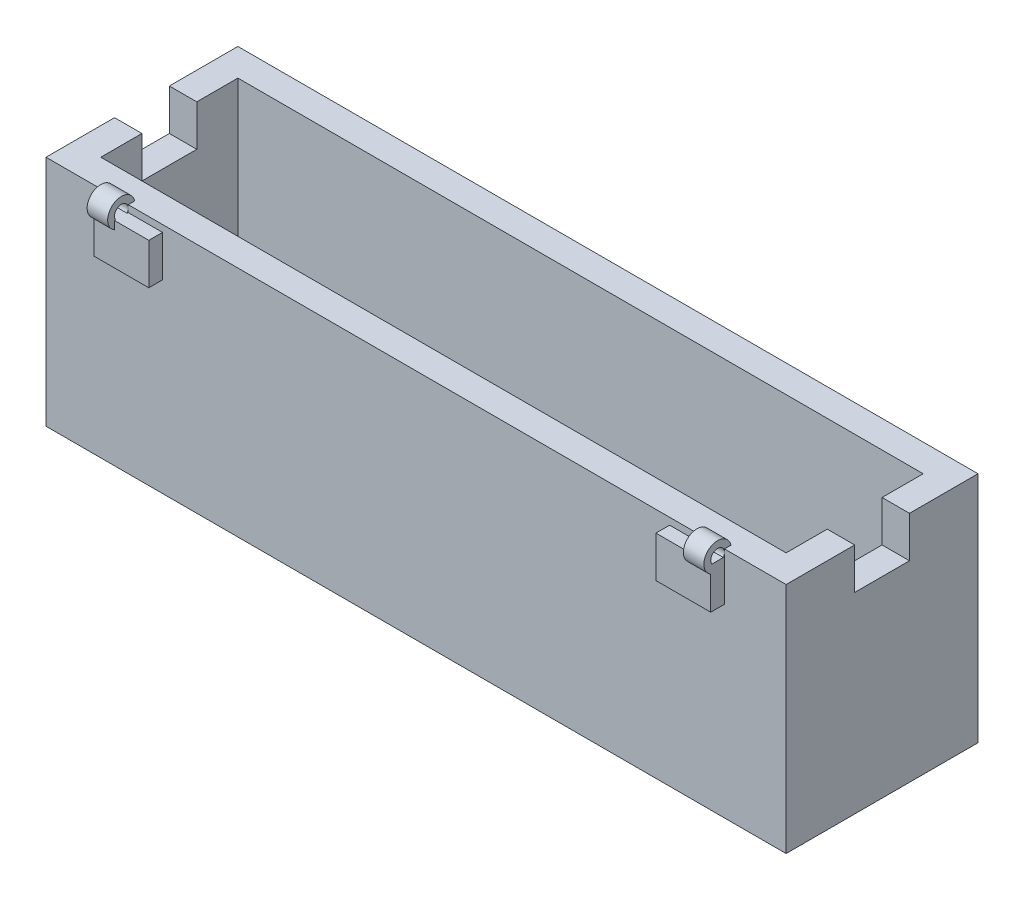
ISO-10303-21;
HEADER;
FILE_DESCRIPTION(('STEP AP214'),'2;1');
FILE_NAME('part.step','',(''),(''),'','','');
FILE_SCHEMA(('AUTOMOTIVE_DESIGN { 1 0 10303 214 1 1 1 1 }'));
ENDSEC;
DATA;
#1=APPLICATION_CONTEXT('core data for automotive mechanical design processes');
#2=APPLICATION_PROTOCOL_DEFINITION('international standard','automotive_design',2000,#1);
#3=PRODUCT_CONTEXT('',#1,'mechanical');
#4=PRODUCT('Part','Part','',(#3));
#5=PRODUCT_RELATED_PRODUCT_CATEGORY('part','',(#4));
#6=PRODUCT_DEFINITION_FORMATION('','',#4);
#7=PRODUCT_DEFINITION_CONTEXT('part definition',#1,'design');
#8=PRODUCT_DEFINITION('design','',#6,#7);
#9=PRODUCT_DEFINITION_SHAPE('','',#8);
#10=(LENGTH_UNIT() NAMED_UNIT(*) SI_UNIT(.MILLI.,.METRE.));
#11=(NAMED_UNIT(*) PLANE_ANGLE_UNIT() SI_UNIT($,.RADIAN.));
#12=(NAMED_UNIT(*) SI_UNIT($,.STERADIAN.) SOLID_ANGLE_UNIT());
#13=UNCERTAINTY_MEASURE_WITH_UNIT(LENGTH_MEASURE(1.E-05),#10,'distance_accuracy_value','');
#14=(GEOMETRIC_REPRESENTATION_CONTEXT(3) GLOBAL_UNCERTAINTY_ASSIGNED_CONTEXT((#13)) GLOBAL_UNIT_ASSIGNED_CONTEXT((#10,
#11,#12)) REPRESENTATION_CONTEXT('',''));
#15=CARTESIAN_POINT('',(0.,0.,0.));
#16=DIRECTION('',(0.,0.,1.));
#17=DIRECTION('',(1.,0.,0.));
#18=AXIS2_PLACEMENT_3D('',#15,#16,#17);
#19=CARTESIAN_POINT('',(0.,140.,0.));
#20=DIRECTION('',(0.,1.,0.));
#21=DIRECTION('',(0.,0.,1.));
#22=AXIS2_PLACEMENT_3D('',#19,#20,#21);
#23=PLANE('',#22);
#24=DIRECTION('',(-1.,0.,0.));
#25=VECTOR('',#24,1.);
#26=CARTESIAN_POINT('',(270.,140.,-20.0000000000002));
#27=LINE('',#26,#25);
#28=CARTESIAN_POINT('',(270.,140.,-20.0000000000002));
#29=VERTEX_POINT('',#28);
#30=CARTESIAN_POINT('',(250.,140.,-20.0000000000002));
#31=VERTEX_POINT('',#30);
#32=EDGE_CURVE('E328',#29,#31,#27,.T.);
#33=ORIENTED_EDGE('',*,*,#32,.F.);
#34=DIRECTION('',(0.,0.,-1.));
#35=VECTOR('',#34,1.);
#36=CARTESIAN_POINT('',(270.,140.,-70.));
#37=LINE('',#36,#35);
#38=CARTESIAN_POINT('',(270.,140.,-70.));
#39=VERTEX_POINT('',#38);
#40=EDGE_CURVE('E485',#29,#39,#37,.T.);
#41=ORIENTED_EDGE('',*,*,#40,.T.);
#42=DIRECTION('',(-1.,0.,0.));
#43=VECTOR('',#42,1.);
#44=CARTESIAN_POINT('',(-270.,140.,-70.));
#45=LINE('',#44,#43);
#46=CARTESIAN_POINT('',(-270.,140.,-70.));
#47=VERTEX_POINT('',#46);
#48=EDGE_CURVE('E496',#39,#47,#45,.T.);
#49=ORIENTED_EDGE('',*,*,#48,.T.);
#50=DIRECTION('',(0.,0.,1.));
#51=VECTOR('',#50,1.);
#52=CARTESIAN_POINT('',(-270.,140.,-70.));
#53=LINE('',#52,#51);
#54=CARTESIAN_POINT('',(-270.,140.,-20.));
#55=VERTEX_POINT('',#54);
#56=EDGE_CURVE('E288',#47,#55,#53,.T.);
#57=ORIENTED_EDGE('',*,*,#56,.T.);
#58=CARTESIAN_POINT('',(-250.,140.,-20.));
#59=VERTEX_POINT('',#58);
#60=EDGE_CURVE('E331',#59,#55,#27,.T.);
#61=ORIENTED_EDGE('',*,*,#60,.F.);
#62=DIRECTION('',(0.,0.,1.));
#63=VECTOR('',#62,1.);
#64=CARTESIAN_POINT('',(-250.,140.,-50.));
#65=LINE('',#64,#63);
#66=CARTESIAN_POINT('',(-250.,140.,-50.));
#67=VERTEX_POINT('',#66);
#68=EDGE_CURVE('E476',#67,#59,#65,.T.);
#69=ORIENTED_EDGE('',*,*,#68,.F.);
#70=DIRECTION('',(-1.,0.,0.));
#71=VECTOR('',#70,1.);
#72=CARTESIAN_POINT('',(-250.,140.,-50.));
#73=LINE('',#72,#71);
#74=CARTESIAN_POINT('',(250.,140.,-50.));
#75=VERTEX_POINT('',#74);
#76=EDGE_CURVE('E472',#75,#67,#73,.T.);
#77=ORIENTED_EDGE('',*,*,#76,.F.);
#78=DIRECTION('',(0.,0.,-1.));
#79=VECTOR('',#78,1.);
#80=CARTESIAN_POINT('',(250.,140.,-50.));
#81=LINE('',#80,#79);
#82=EDGE_CURVE('E468',#31,#75,#81,.T.);
#83=ORIENTED_EDGE('',*,*,#82,.F.);
#84=EDGE_LOOP('',(#33,#41,#49,#57,#61,#69,#77,#83));
#85=FACE_BOUND('',#84,.T.);
#86=ADVANCED_FACE('F45',(#85),#23,.T.);
#87=CARTESIAN_POINT('',(-270.,140.,70.));
#88=DIRECTION('',(0.,0.,-1.));
#89=DIRECTION('',(-1.,0.,0.));
#90=AXIS2_PLACEMENT_3D('',#87,#88,#89);
#91=PLANE('',#90);
#92=DIRECTION('',(0.,1.,0.));
#93=VECTOR('',#92,1.);
#94=CARTESIAN_POINT('',(-210.,140.,70.));
#95=LINE('',#94,#93);
#96=CARTESIAN_POINT('',(-210.,135.,70.));
#97=VERTEX_POINT('',#96);
#98=CARTESIAN_POINT('',(-210.,137.764599118728,69.9999999999953));
#99=VERTEX_POINT('',#98);
#100=EDGE_CURVE('E369',#97,#99,#95,.T.);
#101=ORIENTED_EDGE('',*,*,#100,.F.);
#102=DIRECTION('',(1.,0.,0.));
#103=VECTOR('',#102,1.);
#104=CARTESIAN_POINT('',(-270.,135.,70.));
#105=LINE('',#104,#103);
#106=CARTESIAN_POINT('',(-185.,135.,70.));
#107=VERTEX_POINT('',#106);
#108=EDGE_CURVE('E452',#97,#107,#105,.T.);
#109=ORIENTED_EDGE('',*,*,#108,.T.);
#110=DIRECTION('',(0.,-1.,0.));
#111=VECTOR('',#110,1.);
#112=CARTESIAN_POINT('',(-185.,140.,70.));
#113=LINE('',#112,#111);
#114=CARTESIAN_POINT('',(-185.,105.,70.));
#115=VERTEX_POINT('',#114);
#116=EDGE_CURVE('E465',#107,#115,#113,.T.);
#117=ORIENTED_EDGE('',*,*,#116,.T.);
#118=DIRECTION('',(-1.,0.,0.));
#119=VECTOR('',#118,1.);
#120=CARTESIAN_POINT('',(-270.,105.,70.));
#121=LINE('',#120,#119);
#122=CARTESIAN_POINT('',(-225.,105.,70.));
#123=VERTEX_POINT('',#122);
#124=EDGE_CURVE('E462',#115,#123,#121,.T.);
#125=ORIENTED_EDGE('',*,*,#124,.T.);
#126=DIRECTION('',(0.,1.,0.));
#127=VECTOR('',#126,1.);
#128=CARTESIAN_POINT('',(-225.,140.,70.));
#129=LINE('',#128,#127);
#130=CARTESIAN_POINT('',(-225.,137.764599118728,69.9999999999953));
#131=VERTEX_POINT('',#130);
#132=EDGE_CURVE('E460',#123,#131,#129,.T.);
#133=ORIENTED_EDGE('',*,*,#132,.T.);
#134=DIRECTION('',(0.,1.,0.));
#135=VECTOR('',#134,1.);
#136=CARTESIAN_POINT('',(-225.,140.,70.));
#137=LINE('',#136,#135);
#138=CARTESIAN_POINT('',(-225.,140.,70.));
#139=VERTEX_POINT('',#138);
#140=EDGE_CURVE('E359',#131,#139,#137,.T.);
#141=ORIENTED_EDGE('',*,*,#140,.T.);
#142=DIRECTION('',(1.,0.,0.));
#143=VECTOR('',#142,1.);
#144=CARTESIAN_POINT('',(-270.,140.,70.));
#145=LINE('',#144,#143);
#146=CARTESIAN_POINT('',(-270.,140.,70.));
#147=VERTEX_POINT('',#146);
#148=EDGE_CURVE('E501',#147,#139,#145,.T.);
#149=ORIENTED_EDGE('',*,*,#148,.F.);
#150=DIRECTION('',(0.,-1.,0.));
#151=VECTOR('',#150,1.);
#152=CARTESIAN_POINT('',(-270.,140.,70.));
#153=LINE('',#152,#151);
#154=CARTESIAN_POINT('',(-270.,-30.,70.));
#155=VERTEX_POINT('',#154);
#156=EDGE_CURVE('E292',#147,#155,#153,.T.);
#157=ORIENTED_EDGE('',*,*,#156,.T.);
#158=DIRECTION('',(-1.,0.,0.));
#159=VECTOR('',#158,1.);
#160=CARTESIAN_POINT('',(-270.,-30.,70.));
#161=LINE('',#160,#159);
#162=CARTESIAN_POINT('',(270.,-30.,70.));
#163=VERTEX_POINT('',#162);
#164=EDGE_CURVE('E306',#163,#155,#161,.T.);
#165=ORIENTED_EDGE('',*,*,#164,.F.);
#166=DIRECTION('',(0.,-1.,0.));
#167=VECTOR('',#166,1.);
#168=CARTESIAN_POINT('',(270.,140.,70.));
#169=LINE('',#168,#167);
#170=CARTESIAN_POINT('',(270.,140.,70.));
#171=VERTEX_POINT('',#170);
#172=EDGE_CURVE('E504',#171,#163,#169,.T.);
#173=ORIENTED_EDGE('',*,*,#172,.F.);
#174=CARTESIAN_POINT('',(225.,140.,70.));
#175=VERTEX_POINT('',#174);
#176=EDGE_CURVE('E500',#175,#171,#145,.T.);
#177=ORIENTED_EDGE('',*,*,#176,.F.);
#178=DIRECTION('',(0.,-1.,0.));
#179=VECTOR('',#178,1.);
#180=CARTESIAN_POINT('',(225.,140.,70.));
#181=LINE('',#180,#179);
#182=CARTESIAN_POINT('',(225.,137.76459911873,69.9999999999943));
#183=VERTEX_POINT('',#182);
#184=EDGE_CURVE('E392',#175,#183,#181,.T.);
#185=ORIENTED_EDGE('',*,*,#184,.T.);
#186=DIRECTION('',(0.,-1.,0.));
#187=VECTOR('',#186,1.);
#188=CARTESIAN_POINT('',(225.,140.,70.));
#189=LINE('',#188,#187);
#190=CARTESIAN_POINT('',(225.,105.,70.));
#191=VERTEX_POINT('',#190);
#192=EDGE_CURVE('E436',#183,#191,#189,.T.);
#193=ORIENTED_EDGE('',*,*,#192,.T.);
#194=DIRECTION('',(-1.,0.,0.));
#195=VECTOR('',#194,1.);
#196=CARTESIAN_POINT('',(-270.,105.,70.));
#197=LINE('',#196,#195);
#198=CARTESIAN_POINT('',(185.,105.,70.));
#199=VERTEX_POINT('',#198);
#200=EDGE_CURVE('E433',#191,#199,#197,.T.);
#201=ORIENTED_EDGE('',*,*,#200,.T.);
#202=DIRECTION('',(0.,1.,0.));
#203=VECTOR('',#202,1.);
#204=CARTESIAN_POINT('',(185.,140.,70.));
#205=LINE('',#204,#203);
#206=CARTESIAN_POINT('',(185.,135.,70.));
#207=VERTEX_POINT('',#206);
#208=EDGE_CURVE('E430',#199,#207,#205,.T.);
#209=ORIENTED_EDGE('',*,*,#208,.T.);
#210=DIRECTION('',(1.,0.,0.));
#211=VECTOR('',#210,1.);
#212=CARTESIAN_POINT('',(-270.,135.,70.));
#213=LINE('',#212,#211);
#214=CARTESIAN_POINT('',(210.,135.,70.));
#215=VERTEX_POINT('',#214);
#216=EDGE_CURVE('E420',#207,#215,#213,.T.);
#217=ORIENTED_EDGE('',*,*,#216,.T.);
#218=DIRECTION('',(0.,-1.,0.));
#219=VECTOR('',#218,1.);
#220=CARTESIAN_POINT('',(210.,140.,70.));
#221=LINE('',#220,#219);
#222=CARTESIAN_POINT('',(210.,137.76459911873,69.9999999999943));
#223=VERTEX_POINT('',#222);
#224=EDGE_CURVE('E399',#223,#215,#221,.T.);
#225=ORIENTED_EDGE('',*,*,#224,.F.);
#226=CARTESIAN_POINT('',(210.,140.,70.));
#227=VERTEX_POINT('',#226);
#228=EDGE_CURVE('E401',#227,#223,#221,.T.);
#229=ORIENTED_EDGE('',*,*,#228,.F.);
#230=CARTESIAN_POINT('',(-210.,140.,70.));
#231=VERTEX_POINT('',#230);
#232=EDGE_CURVE('E505',#231,#227,#145,.T.);
#233=ORIENTED_EDGE('',*,*,#232,.F.);
#234=EDGE_CURVE('E371',#99,#231,#95,.T.);
#235=ORIENTED_EDGE('',*,*,#234,.F.);
#236=EDGE_LOOP('',(#101,#109,#117,#125,#133,#141,#149,#157,#165,#173,#177,#185,#193,#201,#209,
#217,#225,#229,#233,#235));
#237=FACE_BOUND('',#236,.T.);
#238=ADVANCED_FACE('F595',(#237),#91,.F.);
#239=DIRECTION('',(-1.,0.,0.));
#240=VECTOR('',#239,1.);
#241=CARTESIAN_POINT('',(270.,140.,19.9999999999998));
#242=LINE('',#241,#240);
#243=CARTESIAN_POINT('',(-250.,140.,20.));
#244=VERTEX_POINT('',#243);
#245=CARTESIAN_POINT('',(-270.,140.,20.));
#246=VERTEX_POINT('',#245);
#247=EDGE_CURVE('E335',#244,#246,#242,.T.);
#248=ORIENTED_EDGE('',*,*,#247,.T.);
#249=EDGE_CURVE('E498',#246,#147,#53,.T.);
#250=ORIENTED_EDGE('',*,*,#249,.T.);
#251=ORIENTED_EDGE('',*,*,#148,.T.);
#252=DIRECTION('',(0.,0.,1.));
#253=VECTOR('',#252,1.);
#254=CARTESIAN_POINT('',(-225.,140.,0.));
#255=LINE('',#254,#253);
#256=CARTESIAN_POINT('',(-225.,140.,65.2530526368458));
#257=VERTEX_POINT('',#256);
#258=EDGE_CURVE('E364',#257,#139,#255,.T.);
#259=ORIENTED_EDGE('',*,*,#258,.F.);
#260=DIRECTION('',(-1.,0.,0.));
#261=VECTOR('',#260,1.);
#262=CARTESIAN_POINT('',(-210.,140.,65.2530526368458));
#263=LINE('',#262,#261);
#264=CARTESIAN_POINT('',(-210.,140.,65.2530526368458));
#265=VERTEX_POINT('',#264);
#266=EDGE_CURVE('E375',#265,#257,#263,.T.);
#267=ORIENTED_EDGE('',*,*,#266,.F.);
#268=DIRECTION('',(0.,0.,1.));
#269=VECTOR('',#268,1.);
#270=CARTESIAN_POINT('',(-210.,140.,0.));
#271=LINE('',#270,#269);
#272=EDGE_CURVE('E372',#265,#231,#271,.T.);
#273=ORIENTED_EDGE('',*,*,#272,.T.);
#274=ORIENTED_EDGE('',*,*,#232,.T.);
#275=DIRECTION('',(0.,0.,-1.));
#276=VECTOR('',#275,1.);
#277=CARTESIAN_POINT('',(210.,140.,0.));
#278=LINE('',#277,#276);
#279=CARTESIAN_POINT('',(210.,140.,65.2530526368443));
#280=VERTEX_POINT('',#279);
#281=EDGE_CURVE('E402',#227,#280,#278,.T.);
#282=ORIENTED_EDGE('',*,*,#281,.T.);
#283=DIRECTION('',(1.,0.,0.));
#284=VECTOR('',#283,1.);
#285=CARTESIAN_POINT('',(210.,140.,65.2530526368443));
#286=LINE('',#285,#284);
#287=CARTESIAN_POINT('',(225.,140.,65.2530526368443));
#288=VERTEX_POINT('',#287);
#289=EDGE_CURVE('E405',#288,#280,#286,.F.);
#290=ORIENTED_EDGE('',*,*,#289,.F.);
#291=DIRECTION('',(0.,0.,-1.));
#292=VECTOR('',#291,1.);
#293=CARTESIAN_POINT('',(225.,140.,0.));
#294=LINE('',#293,#292);
#295=EDGE_CURVE('E389',#175,#288,#294,.T.);
#296=ORIENTED_EDGE('',*,*,#295,.F.);
#297=ORIENTED_EDGE('',*,*,#176,.T.);
#298=CARTESIAN_POINT('',(270.,140.,19.9999999999998));
#299=VERTEX_POINT('',#298);
#300=EDGE_CURVE('E493',#171,#299,#37,.T.);
#301=ORIENTED_EDGE('',*,*,#300,.T.);
#302=CARTESIAN_POINT('',(250.,140.,19.9999999999998));
#303=VERTEX_POINT('',#302);
#304=EDGE_CURVE('E332',#299,#303,#242,.T.);
#305=ORIENTED_EDGE('',*,*,#304,.T.);
#306=CARTESIAN_POINT('',(250.,140.,50.));
#307=VERTEX_POINT('',#306);
#308=EDGE_CURVE('E469',#307,#303,#81,.T.);
#309=ORIENTED_EDGE('',*,*,#308,.F.);
#310=DIRECTION('',(1.,0.,0.));
#311=VECTOR('',#310,1.);
#312=CARTESIAN_POINT('',(-250.,140.,50.));
#313=LINE('',#312,#311);
#314=CARTESIAN_POINT('',(-250.,140.,50.));
#315=VERTEX_POINT('',#314);
#316=EDGE_CURVE('E479',#315,#307,#313,.T.);
#317=ORIENTED_EDGE('',*,*,#316,.F.);
#318=EDGE_CURVE('E475',#244,#315,#65,.T.);
#319=ORIENTED_EDGE('',*,*,#318,.F.);
#320=EDGE_LOOP('',(#248,#250,#251,#259,#267,#273,#274,#282,#290,#296,#297,#301,#305,#309,#317,#319));
#321=FACE_BOUND('',#320,.T.);
#322=ADVANCED_FACE('F552',(#321),#23,.T.);
#323=CARTESIAN_POINT('',(-225.,135.,50.));
#324=DIRECTION('',(0.,1.,0.));
#325=DIRECTION('',(0.,0.,1.));
#326=AXIS2_PLACEMENT_3D('',#323,#324,#325);
#327=PLANE('',#326);
#328=ORIENTED_EDGE('',*,*,#108,.F.);
#329=DIRECTION('',(0.,0.,1.));
#330=VECTOR('',#329,1.);
#331=CARTESIAN_POINT('',(-210.,135.,50.));
#332=LINE('',#331,#330);
#333=CARTESIAN_POINT('',(-210.,135.,70.8338276904611));
#334=VERTEX_POINT('',#333);
#335=EDGE_CURVE('E368',#97,#334,#332,.T.);
#336=ORIENTED_EDGE('',*,*,#335,.T.);
#337=DIRECTION('',(-1.,0.,0.));
#338=VECTOR('',#337,1.);
#339=CARTESIAN_POINT('',(-210.,135.,70.8338276904611));
#340=LINE('',#339,#338);
#341=CARTESIAN_POINT('',(-225.,135.,70.8338276904611));
#342=VERTEX_POINT('',#341);
#343=EDGE_CURVE('E538',#334,#342,#340,.T.);
#344=ORIENTED_EDGE('',*,*,#343,.T.);
#345=DIRECTION('',(0.,0.,1.));
#346=VECTOR('',#345,1.);
#347=CARTESIAN_POINT('',(-225.,135.,50.));
#348=LINE('',#347,#346);
#349=CARTESIAN_POINT('',(-225.,135.,79.1661723095276));
#350=VERTEX_POINT('',#349);
#351=EDGE_CURVE('E456',#342,#350,#348,.T.);
#352=ORIENTED_EDGE('',*,*,#351,.T.);
#353=DIRECTION('',(-1.,0.,0.));
#354=VECTOR('',#353,1.);
#355=CARTESIAN_POINT('',(-210.,135.,79.1661723095276));
#356=LINE('',#355,#354);
#357=CARTESIAN_POINT('',(-210.,135.,79.1661723095276));
#358=VERTEX_POINT('',#357);
#359=EDGE_CURVE('E536',#350,#358,#356,.F.);
#360=ORIENTED_EDGE('',*,*,#359,.T.);
#361=CARTESIAN_POINT('',(-210.,135.,80.));
#362=VERTEX_POINT('',#361);
#363=EDGE_CURVE('E366',#358,#362,#332,.T.);
#364=ORIENTED_EDGE('',*,*,#363,.T.);
#365=DIRECTION('',(-1.,0.,0.));
#366=VECTOR('',#365,1.);
#367=CARTESIAN_POINT('',(-225.,135.,80.));
#368=LINE('',#367,#366);
#369=CARTESIAN_POINT('',(-185.,135.,80.));
#370=VERTEX_POINT('',#369);
#371=EDGE_CURVE('E441',#370,#362,#368,.T.);
#372=ORIENTED_EDGE('',*,*,#371,.F.);
#373=DIRECTION('',(0.,0.,1.));
#374=VECTOR('',#373,1.);
#375=CARTESIAN_POINT('',(-185.,135.,50.));
#376=LINE('',#375,#374);
#377=EDGE_CURVE('E449',#107,#370,#376,.T.);
#378=ORIENTED_EDGE('',*,*,#377,.F.);
#379=EDGE_LOOP('',(#328,#336,#344,#352,#360,#364,#372,#378));
#380=FACE_BOUND('',#379,.T.);
#381=ADVANCED_FACE('F604',(#380),#327,.T.);
#382=CARTESIAN_POINT('',(185.,135.,50.));
#383=DIRECTION('',(0.,1.,0.));
#384=DIRECTION('',(0.,0.,1.));
#385=AXIS2_PLACEMENT_3D('',#382,#383,#384);
#386=PLANE('',#385);
#387=DIRECTION('',(-1.,0.,0.));
#388=VECTOR('',#387,1.);
#389=CARTESIAN_POINT('',(185.,135.,80.));
#390=LINE('',#389,#388);
#391=CARTESIAN_POINT('',(210.,135.,80.));
#392=VERTEX_POINT('',#391);
#393=CARTESIAN_POINT('',(185.,135.,80.));
#394=VERTEX_POINT('',#393);
#395=EDGE_CURVE('E409',#392,#394,#390,.T.);
#396=ORIENTED_EDGE('',*,*,#395,.F.);
#397=DIRECTION('',(0.,0.,-1.));
#398=VECTOR('',#397,1.);
#399=CARTESIAN_POINT('',(210.,135.,50.));
#400=LINE('',#399,#398);
#401=CARTESIAN_POINT('',(210.,135.,79.166172309527));
#402=VERTEX_POINT('',#401);
#403=EDGE_CURVE('E395',#392,#402,#400,.T.);
#404=ORIENTED_EDGE('',*,*,#403,.T.);
#405=DIRECTION('',(1.,0.,0.));
#406=VECTOR('',#405,1.);
#407=CARTESIAN_POINT('',(210.,135.,79.166172309527));
#408=LINE('',#407,#406);
#409=CARTESIAN_POINT('',(225.,135.,79.166172309527));
#410=VERTEX_POINT('',#409);
#411=EDGE_CURVE('E529',#402,#410,#408,.T.);
#412=ORIENTED_EDGE('',*,*,#411,.T.);
#413=DIRECTION('',(0.,0.,1.));
#414=VECTOR('',#413,1.);
#415=CARTESIAN_POINT('',(225.,135.,50.));
#416=LINE('',#415,#414);
#417=CARTESIAN_POINT('',(225.,135.,70.8338276904617));
#418=VERTEX_POINT('',#417);
#419=EDGE_CURVE('E417',#418,#410,#416,.T.);
#420=ORIENTED_EDGE('',*,*,#419,.F.);
#421=DIRECTION('',(1.,0.,0.));
#422=VECTOR('',#421,1.);
#423=CARTESIAN_POINT('',(210.,135.,70.8338276904617));
#424=LINE('',#423,#422);
#425=CARTESIAN_POINT('',(210.,135.,70.8338276904617));
#426=VERTEX_POINT('',#425);
#427=EDGE_CURVE('E526',#418,#426,#424,.F.);
#428=ORIENTED_EDGE('',*,*,#427,.T.);
#429=EDGE_CURVE('E398',#426,#215,#400,.T.);
#430=ORIENTED_EDGE('',*,*,#429,.T.);
#431=ORIENTED_EDGE('',*,*,#216,.F.);
#432=DIRECTION('',(0.,0.,1.));
#433=VECTOR('',#432,1.);
#434=CARTESIAN_POINT('',(185.,135.,50.));
#435=LINE('',#434,#433);
#436=EDGE_CURVE('E423',#207,#394,#435,.T.);
#437=ORIENTED_EDGE('',*,*,#436,.T.);
#438=EDGE_LOOP('',(#396,#404,#412,#420,#428,#430,#431,#437));
#439=FACE_BOUND('',#438,.T.);
#440=ADVANCED_FACE('F608',(#439),#386,.T.);
#441=CARTESIAN_POINT('',(270.,140.,-70.));
#442=DIRECTION('',(-1.,0.,0.));
#443=DIRECTION('',(0.,0.,1.));
#444=AXIS2_PLACEMENT_3D('',#441,#442,#443);
#445=PLANE('',#444);
#446=ORIENTED_EDGE('',*,*,#40,.F.);
#447=DIRECTION('',(0.,-1.,0.));
#448=VECTOR('',#447,1.);
#449=CARTESIAN_POINT('',(270.,140.,-20.0000000000002));
#450=LINE('',#449,#448);
#451=CARTESIAN_POINT('',(270.,110.,-20.0000000000002));
#452=VERTEX_POINT('',#451);
#453=EDGE_CURVE('E312',#29,#452,#450,.T.);
#454=ORIENTED_EDGE('',*,*,#453,.T.);
#455=DIRECTION('',(0.,0.,1.));
#456=VECTOR('',#455,1.);
#457=CARTESIAN_POINT('',(270.,110.,-20.0000000000002));
#458=LINE('',#457,#456);
#459=CARTESIAN_POINT('',(270.,110.,19.9999999999998));
#460=VERTEX_POINT('',#459);
#461=EDGE_CURVE('E315',#452,#460,#458,.T.);
#462=ORIENTED_EDGE('',*,*,#461,.T.);
#463=DIRECTION('',(0.,1.,0.));
#464=VECTOR('',#463,1.);
#465=CARTESIAN_POINT('',(270.,140.,19.9999999999998));
#466=LINE('',#465,#464);
#467=EDGE_CURVE('E319',#460,#299,#466,.T.);
#468=ORIENTED_EDGE('',*,*,#467,.T.);
#469=ORIENTED_EDGE('',*,*,#300,.F.);
#470=ORIENTED_EDGE('',*,*,#172,.T.);
#471=DIRECTION('',(0.,0.,1.));
#472=VECTOR('',#471,1.);
#473=CARTESIAN_POINT('',(270.,-30.,-70.));
#474=LINE('',#473,#472);
#475=CARTESIAN_POINT('',(270.,-30.,-70.));
#476=VERTEX_POINT('',#475);
#477=EDGE_CURVE('E301',#476,#163,#474,.T.);
#478=ORIENTED_EDGE('',*,*,#477,.F.);
#479=DIRECTION('',(0.,-1.,0.));
#480=VECTOR('',#479,1.);
#481=CARTESIAN_POINT('',(270.,140.,-70.));
#482=LINE('',#481,#480);
#483=EDGE_CURVE('E291',#39,#476,#482,.T.);
#484=ORIENTED_EDGE('',*,*,#483,.F.);
#485=EDGE_LOOP('',(#446,#454,#462,#468,#469,#470,#478,#484));
#486=FACE_BOUND('',#485,.T.);
#487=ADVANCED_FACE('F47',(#486),#445,.F.);
#488=CARTESIAN_POINT('',(-270.,140.,-70.));
#489=DIRECTION('',(0.,0.,1.));
#490=DIRECTION('',(1.,0.,0.));
#491=AXIS2_PLACEMENT_3D('',#488,#489,#490);
#492=PLANE('',#491);
#493=ORIENTED_EDGE('',*,*,#483,.T.);
#494=DIRECTION('',(1.,0.,0.));
#495=VECTOR('',#494,1.);
#496=CARTESIAN_POINT('',(-270.,-30.,-70.));
#497=LINE('',#496,#495);
#498=CARTESIAN_POINT('',(-270.,-30.,-70.));
#499=VERTEX_POINT('',#498);
#500=EDGE_CURVE('E295',#499,#476,#497,.T.);
#501=ORIENTED_EDGE('',*,*,#500,.F.);
#502=DIRECTION('',(0.,-1.,0.));
#503=VECTOR('',#502,1.);
#504=CARTESIAN_POINT('',(-270.,140.,-70.));
#505=LINE('',#504,#503);
#506=EDGE_CURVE('E279',#47,#499,#505,.T.);
#507=ORIENTED_EDGE('',*,*,#506,.F.);
#508=ORIENTED_EDGE('',*,*,#48,.F.);
#509=EDGE_LOOP('',(#493,#501,#507,#508));
#510=FACE_BOUND('',#509,.T.);
#511=ADVANCED_FACE('F296',(#510),#492,.F.);
#512=CARTESIAN_POINT('',(-270.,140.,-70.));
#513=DIRECTION('',(1.,0.,0.));
#514=DIRECTION('',(0.,0.,-1.));
#515=AXIS2_PLACEMENT_3D('',#512,#513,#514);
#516=PLANE('',#515);
#517=DIRECTION('',(0.,0.,1.));
#518=VECTOR('',#517,1.);
#519=CARTESIAN_POINT('',(-270.,110.,-20.));
#520=LINE('',#519,#518);
#521=CARTESIAN_POINT('',(-270.,110.,-20.));
#522=VERTEX_POINT('',#521);
#523=CARTESIAN_POINT('',(-270.,110.,20.));
#524=VERTEX_POINT('',#523);
#525=EDGE_CURVE('E325',#522,#524,#520,.T.);
#526=ORIENTED_EDGE('',*,*,#525,.F.);
#527=DIRECTION('',(0.,-1.,0.));
#528=VECTOR('',#527,1.);
#529=CARTESIAN_POINT('',(-270.,140.,-20.));
#530=LINE('',#529,#528);
#531=EDGE_CURVE('E311',#55,#522,#530,.T.);
#532=ORIENTED_EDGE('',*,*,#531,.F.);
#533=ORIENTED_EDGE('',*,*,#56,.F.);
#534=ORIENTED_EDGE('',*,*,#506,.T.);
#535=DIRECTION('',(0.,0.,-1.));
#536=VECTOR('',#535,1.);
#537=CARTESIAN_POINT('',(-270.,-30.,-70.));
#538=LINE('',#537,#536);
#539=EDGE_CURVE('E285',#155,#499,#538,.T.);
#540=ORIENTED_EDGE('',*,*,#539,.F.);
#541=ORIENTED_EDGE('',*,*,#156,.F.);
#542=ORIENTED_EDGE('',*,*,#249,.F.);
#543=DIRECTION('',(0.,1.,0.));
#544=VECTOR('',#543,1.);
#545=CARTESIAN_POINT('',(-270.,140.,20.));
#546=LINE('',#545,#544);
#547=EDGE_CURVE('E316',#524,#246,#546,.T.);
#548=ORIENTED_EDGE('',*,*,#547,.F.);
#549=EDGE_LOOP('',(#526,#532,#533,#534,#540,#541,#542,#548));
#550=FACE_BOUND('',#549,.T.);
#551=ADVANCED_FACE('F282',(#550),#516,.F.);
#552=CARTESIAN_POINT('',(250.,-9.99999999999998,-50.));
#553=DIRECTION('',(1.,0.,0.));
#554=DIRECTION('',(0.,0.,-1.));
#555=AXIS2_PLACEMENT_3D('',#552,#553,#554);
#556=PLANE('',#555);
#557=DIRECTION('',(0.,0.,-1.));
#558=VECTOR('',#557,1.);
#559=CARTESIAN_POINT('',(250.,110.,-50.));
#560=LINE('',#559,#558);
#561=CARTESIAN_POINT('',(250.,110.,19.9999999999998));
#562=VERTEX_POINT('',#561);
#563=CARTESIAN_POINT('',(250.,110.,-20.0000000000002));
#564=VERTEX_POINT('',#563);
#565=EDGE_CURVE('E330',#562,#564,#560,.T.);
#566=ORIENTED_EDGE('',*,*,#565,.T.);
#567=DIRECTION('',(0.,1.,0.));
#568=VECTOR('',#567,1.);
#569=CARTESIAN_POINT('',(250.,-9.99999999999998,-20.0000000000002));
#570=LINE('',#569,#568);
#571=EDGE_CURVE('E345',#564,#31,#570,.T.);
#572=ORIENTED_EDGE('',*,*,#571,.T.);
#573=ORIENTED_EDGE('',*,*,#82,.T.);
#574=DIRECTION('',(0.,1.,0.));
#575=VECTOR('',#574,1.);
#576=CARTESIAN_POINT('',(250.,-9.99999999999998,-50.));
#577=LINE('',#576,#575);
#578=CARTESIAN_POINT('',(250.,0.,-50.));
#579=VERTEX_POINT('',#578);
#580=EDGE_CURVE('E482',#579,#75,#577,.T.);
#581=ORIENTED_EDGE('',*,*,#580,.F.);
#582=DIRECTION('',(0.,0.,-1.));
#583=VECTOR('',#582,1.);
#584=CARTESIAN_POINT('',(250.,0.,0.));
#585=LINE('',#584,#583);
#586=CARTESIAN_POINT('',(250.,0.,50.));
#587=VERTEX_POINT('',#586);
#588=EDGE_CURVE('E518',#587,#579,#585,.T.);
#589=ORIENTED_EDGE('',*,*,#588,.F.);
#590=DIRECTION('',(0.,1.,0.));
#591=VECTOR('',#590,1.);
#592=CARTESIAN_POINT('',(250.,-9.99999999999998,50.));
#593=LINE('',#592,#591);
#594=EDGE_CURVE('E483',#587,#307,#593,.T.);
#595=ORIENTED_EDGE('',*,*,#594,.T.);
#596=ORIENTED_EDGE('',*,*,#308,.T.);
#597=DIRECTION('',(0.,-1.,0.));
#598=VECTOR('',#597,1.);
#599=CARTESIAN_POINT('',(250.,-9.99999999999998,19.9999999999998));
#600=LINE('',#599,#598);
#601=EDGE_CURVE('E342',#303,#562,#600,.T.);
#602=ORIENTED_EDGE('',*,*,#601,.T.);
#603=EDGE_LOOP('',(#566,#572,#573,#581,#589,#595,#596,#602));
#604=FACE_BOUND('',#603,.T.);
#605=ADVANCED_FACE('F566',(#604),#556,.F.);
#606=CARTESIAN_POINT('',(-250.,-9.99999999999998,50.));
#607=DIRECTION('',(0.,0.,1.));
#608=DIRECTION('',(1.,0.,0.));
#609=AXIS2_PLACEMENT_3D('',#606,#607,#608);
#610=PLANE('',#609);
#611=DIRECTION('',(0.,1.,0.));
#612=VECTOR('',#611,1.);
#613=CARTESIAN_POINT('',(-250.,-9.99999999999998,50.));
#614=LINE('',#613,#612);
#615=CARTESIAN_POINT('',(-250.,0.,50.));
#616=VERTEX_POINT('',#615);
#617=EDGE_CURVE('E486',#616,#315,#614,.T.);
#618=ORIENTED_EDGE('',*,*,#617,.T.);
#619=ORIENTED_EDGE('',*,*,#316,.T.);
#620=ORIENTED_EDGE('',*,*,#594,.F.);
#621=DIRECTION('',(1.,0.,0.));
#622=VECTOR('',#621,1.);
#623=CARTESIAN_POINT('',(0.,0.,50.));
#624=LINE('',#623,#622);
#625=EDGE_CURVE('E515',#616,#587,#624,.T.);
#626=ORIENTED_EDGE('',*,*,#625,.F.);
#627=EDGE_LOOP('',(#618,#619,#620,#626));
#628=FACE_BOUND('',#627,.T.);
#629=ADVANCED_FACE('F557',(#628),#610,.F.);
#630=CARTESIAN_POINT('',(-250.,-9.99999999999998,-50.));
#631=DIRECTION('',(-1.,0.,0.));
#632=DIRECTION('',(0.,0.,1.));
#633=AXIS2_PLACEMENT_3D('',#630,#631,#632);
#634=PLANE('',#633);
#635=ORIENTED_EDGE('',*,*,#68,.T.);
#636=DIRECTION('',(0.,-1.,0.));
#637=VECTOR('',#636,1.);
#638=CARTESIAN_POINT('',(-250.,-9.99999999999998,-20.));
#639=LINE('',#638,#637);
#640=CARTESIAN_POINT('',(-250.,110.,-20.));
#641=VERTEX_POINT('',#640);
#642=EDGE_CURVE('E12',#59,#641,#639,.T.);
#643=ORIENTED_EDGE('',*,*,#642,.T.);
#644=DIRECTION('',(0.,0.,1.));
#645=VECTOR('',#644,1.);
#646=CARTESIAN_POINT('',(-250.,110.,-50.));
#647=LINE('',#646,#645);
#648=CARTESIAN_POINT('',(-250.,110.,20.));
#649=VERTEX_POINT('',#648);
#650=EDGE_CURVE('E541',#641,#649,#647,.T.);
#651=ORIENTED_EDGE('',*,*,#650,.T.);
#652=DIRECTION('',(0.,1.,0.));
#653=VECTOR('',#652,1.);
#654=CARTESIAN_POINT('',(-250.,-9.99999999999998,20.));
#655=LINE('',#654,#653);
#656=EDGE_CURVE('E53',#649,#244,#655,.T.);
#657=ORIENTED_EDGE('',*,*,#656,.T.);
#658=ORIENTED_EDGE('',*,*,#318,.T.);
#659=ORIENTED_EDGE('',*,*,#617,.F.);
#660=DIRECTION('',(0.,0.,1.));
#661=VECTOR('',#660,1.);
#662=CARTESIAN_POINT('',(-250.,0.,0.));
#663=LINE('',#662,#661);
#664=CARTESIAN_POINT('',(-250.,0.,-50.));
#665=VERTEX_POINT('',#664);
#666=EDGE_CURVE('E512',#665,#616,#663,.T.);
#667=ORIENTED_EDGE('',*,*,#666,.F.);
#668=DIRECTION('',(0.,1.,0.));
#669=VECTOR('',#668,1.);
#670=CARTESIAN_POINT('',(-250.,-9.99999999999998,-50.));
#671=LINE('',#670,#669);
#672=EDGE_CURVE('E489',#665,#67,#671,.T.);
#673=ORIENTED_EDGE('',*,*,#672,.T.);
#674=EDGE_LOOP('',(#635,#643,#651,#657,#658,#659,#667,#673));
#675=FACE_BOUND('',#674,.T.);
#676=ADVANCED_FACE('F546',(#675),#634,.F.);
#677=CARTESIAN_POINT('',(-250.,-9.99999999999998,-50.));
#678=DIRECTION('',(0.,0.,-1.));
#679=DIRECTION('',(-1.,0.,0.));
#680=AXIS2_PLACEMENT_3D('',#677,#678,#679);
#681=PLANE('',#680);
#682=ORIENTED_EDGE('',*,*,#580,.T.);
#683=ORIENTED_EDGE('',*,*,#76,.T.);
#684=ORIENTED_EDGE('',*,*,#672,.F.);
#685=DIRECTION('',(-1.,0.,0.));
#686=VECTOR('',#685,1.);
#687=CARTESIAN_POINT('',(0.,0.,-50.));
#688=LINE('',#687,#686);
#689=EDGE_CURVE('E509',#579,#665,#688,.T.);
#690=ORIENTED_EDGE('',*,*,#689,.F.);
#691=EDGE_LOOP('',(#682,#683,#684,#690));
#692=FACE_BOUND('',#691,.T.);
#693=ADVANCED_FACE('F563',(#692),#681,.F.);
#694=CARTESIAN_POINT('',(-185.,135.,50.));
#695=DIRECTION('',(1.,0.,0.));
#696=DIRECTION('',(0.,1.,0.));
#697=AXIS2_PLACEMENT_3D('',#694,#695,#696);
#698=PLANE('',#697);
#699=ORIENTED_EDGE('',*,*,#116,.F.);
#700=ORIENTED_EDGE('',*,*,#377,.T.);
#701=DIRECTION('',(0.,1.,0.));
#702=VECTOR('',#701,1.);
#703=CARTESIAN_POINT('',(-185.,135.,80.));
#704=LINE('',#703,#702);
#705=CARTESIAN_POINT('',(-185.,105.,80.));
#706=VERTEX_POINT('',#705);
#707=EDGE_CURVE('E438',#706,#370,#704,.T.);
#708=ORIENTED_EDGE('',*,*,#707,.F.);
#709=DIRECTION('',(0.,0.,1.));
#710=VECTOR('',#709,1.);
#711=CARTESIAN_POINT('',(-185.,105.,50.));
#712=LINE('',#711,#710);
#713=EDGE_CURVE('E450',#115,#706,#712,.T.);
#714=ORIENTED_EDGE('',*,*,#713,.F.);
#715=EDGE_LOOP('',(#699,#700,#708,#714));
#716=FACE_BOUND('',#715,.T.);
#717=ADVANCED_FACE('F621',(#716),#698,.T.);
#718=CARTESIAN_POINT('',(-225.,105.,50.));
#719=DIRECTION('',(0.,-1.,0.));
#720=DIRECTION('',(1.,0.,0.));
#721=AXIS2_PLACEMENT_3D('',#718,#719,#720);
#722=PLANE('',#721);
#723=ORIENTED_EDGE('',*,*,#124,.F.);
#724=ORIENTED_EDGE('',*,*,#713,.T.);
#725=DIRECTION('',(1.,0.,0.));
#726=VECTOR('',#725,1.);
#727=CARTESIAN_POINT('',(-225.,105.,80.));
#728=LINE('',#727,#726);
#729=CARTESIAN_POINT('',(-225.,105.,80.));
#730=VERTEX_POINT('',#729);
#731=EDGE_CURVE('E446',#730,#706,#728,.T.);
#732=ORIENTED_EDGE('',*,*,#731,.F.);
#733=DIRECTION('',(0.,0.,1.));
#734=VECTOR('',#733,1.);
#735=CARTESIAN_POINT('',(-225.,105.,50.));
#736=LINE('',#735,#734);
#737=EDGE_CURVE('E453',#123,#730,#736,.T.);
#738=ORIENTED_EDGE('',*,*,#737,.F.);
#739=EDGE_LOOP('',(#723,#724,#732,#738));
#740=FACE_BOUND('',#739,.T.);
#741=ADVANCED_FACE('F624',(#740),#722,.T.);
#742=CARTESIAN_POINT('',(-225.,135.,50.));
#743=DIRECTION('',(-1.,0.,0.));
#744=DIRECTION('',(0.,0.,1.));
#745=AXIS2_PLACEMENT_3D('',#742,#743,#744);
#746=PLANE('',#745);
#747=DIRECTION('',(0.,-1.,0.));
#748=VECTOR('',#747,1.);
#749=CARTESIAN_POINT('',(-225.,135.,80.));
#750=LINE('',#749,#748);
#751=CARTESIAN_POINT('',(-225.,129.104345080888,80.));
#752=VERTEX_POINT('',#751);
#753=EDGE_CURVE('E444',#752,#730,#750,.T.);
#754=ORIENTED_EDGE('',*,*,#753,.F.);
#755=CARTESIAN_POINT('',(-225.,137.764599118728,74.9999999999943));
#756=DIRECTION('',(-1.,0.,0.));
#757=DIRECTION('',(0.,0.,1.));
#758=AXIS2_PLACEMENT_3D('',#755,#756,#757);
#759=CIRCLE('',#758,9.99999999999908);
#760=EDGE_CURVE('E352',#752,#257,#759,.T.);
#761=ORIENTED_EDGE('',*,*,#760,.T.);
#762=ORIENTED_EDGE('',*,*,#258,.T.);
#763=ORIENTED_EDGE('',*,*,#140,.F.);
#764=CARTESIAN_POINT('',(-225.,137.764599118728,74.9999999999943));
#765=DIRECTION('',(-1.,0.,0.));
#766=DIRECTION('',(0.,0.,1.));
#767=AXIS2_PLACEMENT_3D('',#764,#765,#766);
#768=CIRCLE('',#767,4.99999999999907);
#769=EDGE_CURVE('E348',#350,#131,#768,.T.);
#770=ORIENTED_EDGE('',*,*,#769,.F.);
#771=ORIENTED_EDGE('',*,*,#351,.F.);
#772=EDGE_CURVE('E354',#131,#342,#768,.T.);
#773=ORIENTED_EDGE('',*,*,#772,.F.);
#774=ORIENTED_EDGE('',*,*,#132,.F.);
#775=ORIENTED_EDGE('',*,*,#737,.T.);
#776=EDGE_LOOP('',(#754,#761,#762,#763,#770,#771,#773,#774,#775));
#777=FACE_BOUND('',#776,.T.);
#778=ADVANCED_FACE('F619',(#777),#746,.T.);
#779=CARTESIAN_POINT('',(0.,0.,80.));
#780=DIRECTION('',(0.,0.,1.));
#781=DIRECTION('',(1.,0.,0.));
#782=AXIS2_PLACEMENT_3D('',#779,#780,#781);
#783=PLANE('',#782);
#784=DIRECTION('',(-1.,0.,0.));
#785=VECTOR('',#784,1.);
#786=CARTESIAN_POINT('',(-210.,129.104345080888,80.));
#787=LINE('',#786,#785);
#788=CARTESIAN_POINT('',(-210.,129.104345080888,80.));
#789=VERTEX_POINT('',#788);
#790=EDGE_CURVE('E533',#752,#789,#787,.F.);
#791=ORIENTED_EDGE('',*,*,#790,.F.);
#792=ORIENTED_EDGE('',*,*,#753,.T.);
#793=ORIENTED_EDGE('',*,*,#731,.T.);
#794=ORIENTED_EDGE('',*,*,#707,.T.);
#795=ORIENTED_EDGE('',*,*,#371,.T.);
#796=DIRECTION('',(0.,-1.,0.));
#797=VECTOR('',#796,1.);
#798=CARTESIAN_POINT('',(-210.,0.,80.));
#799=LINE('',#798,#797);
#800=EDGE_CURVE('E531',#362,#789,#799,.T.);
#801=ORIENTED_EDGE('',*,*,#800,.T.);
#802=EDGE_LOOP('',(#791,#792,#793,#794,#795,#801));
#803=FACE_BOUND('',#802,.T.);
#804=ADVANCED_FACE('F727',(#803),#783,.T.);
#805=CARTESIAN_POINT('',(225.,135.,50.));
#806=DIRECTION('',(1.,0.,0.));
#807=DIRECTION('',(0.,0.,-1.));
#808=AXIS2_PLACEMENT_3D('',#805,#806,#807);
#809=PLANE('',#808);
#810=DIRECTION('',(0.,0.,1.));
#811=VECTOR('',#810,1.);
#812=CARTESIAN_POINT('',(225.,105.,50.));
#813=LINE('',#812,#811);
#814=CARTESIAN_POINT('',(225.,105.,80.));
#815=VERTEX_POINT('',#814);
#816=EDGE_CURVE('E418',#191,#815,#813,.T.);
#817=ORIENTED_EDGE('',*,*,#816,.F.);
#818=ORIENTED_EDGE('',*,*,#192,.F.);
#819=CARTESIAN_POINT('',(225.,137.76459911873,74.9999999999943));
#820=DIRECTION('',(1.,0.,0.));
#821=DIRECTION('',(0.,0.,-1.));
#822=AXIS2_PLACEMENT_3D('',#819,#820,#821);
#823=CIRCLE('',#822,5.00000000000001);
#824=EDGE_CURVE('E377',#418,#183,#823,.T.);
#825=ORIENTED_EDGE('',*,*,#824,.F.);
#826=ORIENTED_EDGE('',*,*,#419,.T.);
#827=EDGE_CURVE('E383',#183,#410,#823,.T.);
#828=ORIENTED_EDGE('',*,*,#827,.F.);
#829=ORIENTED_EDGE('',*,*,#184,.F.);
#830=ORIENTED_EDGE('',*,*,#295,.T.);
#831=CARTESIAN_POINT('',(225.,137.76459911873,74.9999999999943));
#832=DIRECTION('',(1.,0.,0.));
#833=DIRECTION('',(0.,0.,-1.));
#834=AXIS2_PLACEMENT_3D('',#831,#832,#833);
#835=CIRCLE('',#834,10.);
#836=CARTESIAN_POINT('',(225.,129.104345080889,80.));
#837=VERTEX_POINT('',#836);
#838=EDGE_CURVE('E381',#288,#837,#835,.T.);
#839=ORIENTED_EDGE('',*,*,#838,.T.);
#840=DIRECTION('',(0.,1.,0.));
#841=VECTOR('',#840,1.);
#842=CARTESIAN_POINT('',(225.,135.,80.));
#843=LINE('',#842,#841);
#844=EDGE_CURVE('E407',#815,#837,#843,.T.);
#845=ORIENTED_EDGE('',*,*,#844,.F.);
#846=EDGE_LOOP('',(#817,#818,#825,#826,#828,#829,#830,#839,#845));
#847=FACE_BOUND('',#846,.T.);
#848=ADVANCED_FACE('F676',(#847),#809,.T.);
#849=CARTESIAN_POINT('',(185.,105.,50.));
#850=DIRECTION('',(0.,-1.,0.));
#851=DIRECTION('',(0.,0.,-1.));
#852=AXIS2_PLACEMENT_3D('',#849,#850,#851);
#853=PLANE('',#852);
#854=ORIENTED_EDGE('',*,*,#200,.F.);
#855=ORIENTED_EDGE('',*,*,#816,.T.);
#856=DIRECTION('',(1.,0.,0.));
#857=VECTOR('',#856,1.);
#858=CARTESIAN_POINT('',(185.,105.,80.));
#859=LINE('',#858,#857);
#860=CARTESIAN_POINT('',(185.,105.,80.));
#861=VERTEX_POINT('',#860);
#862=EDGE_CURVE('E414',#861,#815,#859,.T.);
#863=ORIENTED_EDGE('',*,*,#862,.F.);
#864=DIRECTION('',(0.,0.,1.));
#865=VECTOR('',#864,1.);
#866=CARTESIAN_POINT('',(185.,105.,50.));
#867=LINE('',#866,#865);
#868=EDGE_CURVE('E421',#199,#861,#867,.T.);
#869=ORIENTED_EDGE('',*,*,#868,.F.);
#870=EDGE_LOOP('',(#854,#855,#863,#869));
#871=FACE_BOUND('',#870,.T.);
#872=ADVANCED_FACE('F702',(#871),#853,.T.);
#873=CARTESIAN_POINT('',(185.,135.,50.));
#874=DIRECTION('',(-1.,0.,0.));
#875=DIRECTION('',(0.,-1.,0.));
#876=AXIS2_PLACEMENT_3D('',#873,#874,#875);
#877=PLANE('',#876);
#878=ORIENTED_EDGE('',*,*,#208,.F.);
#879=ORIENTED_EDGE('',*,*,#868,.T.);
#880=DIRECTION('',(0.,-1.,0.));
#881=VECTOR('',#880,1.);
#882=CARTESIAN_POINT('',(185.,135.,80.));
#883=LINE('',#882,#881);
#884=EDGE_CURVE('E411',#394,#861,#883,.T.);
#885=ORIENTED_EDGE('',*,*,#884,.F.);
#886=ORIENTED_EDGE('',*,*,#436,.F.);
#887=EDGE_LOOP('',(#878,#879,#885,#886));
#888=FACE_BOUND('',#887,.T.);
#889=ADVANCED_FACE('F699',(#888),#877,.T.);
#890=CARTESIAN_POINT('',(0.,0.,80.));
#891=DIRECTION('',(0.,0.,1.));
#892=DIRECTION('',(1.,0.,0.));
#893=AXIS2_PLACEMENT_3D('',#890,#891,#892);
#894=PLANE('',#893);
#895=DIRECTION('',(1.,0.,0.));
#896=VECTOR('',#895,1.);
#897=CARTESIAN_POINT('',(210.,129.104345080889,80.));
#898=LINE('',#897,#896);
#899=CARTESIAN_POINT('',(210.,129.104345080889,80.));
#900=VERTEX_POINT('',#899);
#901=EDGE_CURVE('E523',#900,#837,#898,.T.);
#902=ORIENTED_EDGE('',*,*,#901,.F.);
#903=DIRECTION('',(0.,1.,0.));
#904=VECTOR('',#903,1.);
#905=CARTESIAN_POINT('',(210.,0.,80.));
#906=LINE('',#905,#904);
#907=EDGE_CURVE('E521',#900,#392,#906,.T.);
#908=ORIENTED_EDGE('',*,*,#907,.T.);
#909=ORIENTED_EDGE('',*,*,#395,.T.);
#910=ORIENTED_EDGE('',*,*,#884,.T.);
#911=ORIENTED_EDGE('',*,*,#862,.T.);
#912=ORIENTED_EDGE('',*,*,#844,.T.);
#913=EDGE_LOOP('',(#902,#908,#909,#910,#911,#912));
#914=FACE_BOUND('',#913,.T.);
#915=ADVANCED_FACE('F706',(#914),#894,.T.);
#916=CARTESIAN_POINT('',(210.,137.76459911873,74.9999999999943));
#917=DIRECTION('',(1.,0.,0.));
#918=DIRECTION('',(0.,0.,-1.));
#919=AXIS2_PLACEMENT_3D('',#916,#917,#918);
#920=CYLINDRICAL_SURFACE('',#919,5.00000000000001);
#921=CARTESIAN_POINT('',(210.,137.76459911873,74.9999999999943));
#922=DIRECTION('',(1.,0.,0.));
#923=DIRECTION('',(0.,0.,-1.));
#924=AXIS2_PLACEMENT_3D('',#921,#922,#923);
#925=CIRCLE('',#924,5.00000000000001);
#926=EDGE_CURVE('E378',#223,#402,#925,.T.);
#927=ORIENTED_EDGE('',*,*,#926,.F.);
#928=EDGE_CURVE('E382',#426,#223,#925,.T.);
#929=ORIENTED_EDGE('',*,*,#928,.F.);
#930=ORIENTED_EDGE('',*,*,#427,.F.);
#931=ORIENTED_EDGE('',*,*,#824,.T.);
#932=ORIENTED_EDGE('',*,*,#827,.T.);
#933=ORIENTED_EDGE('',*,*,#411,.F.);
#934=EDGE_LOOP('',(#927,#929,#930,#931,#932,#933));
#935=FACE_BOUND('',#934,.T.);
#936=ADVANCED_FACE('F684',(#935),#920,.F.);
#937=CARTESIAN_POINT('',(210.,137.76459911873,74.9999999999943));
#938=DIRECTION('',(1.,0.,0.));
#939=DIRECTION('',(0.,0.,-1.));
#940=AXIS2_PLACEMENT_3D('',#937,#938,#939);
#941=PLANE('',#940);
#942=ORIENTED_EDGE('',*,*,#928,.T.);
#943=ORIENTED_EDGE('',*,*,#224,.T.);
#944=ORIENTED_EDGE('',*,*,#429,.F.);
#945=EDGE_LOOP('',(#942,#943,#944));
#946=FACE_BOUND('',#945,.T.);
#947=ADVANCED_FACE('F695',(#946),#941,.F.);
#948=CARTESIAN_POINT('',(210.,137.76459911873,74.9999999999943));
#949=DIRECTION('',(1.,0.,0.));
#950=DIRECTION('',(0.,0.,-1.));
#951=AXIS2_PLACEMENT_3D('',#948,#949,#950);
#952=CYLINDRICAL_SURFACE('',#951,10.);
#953=ORIENTED_EDGE('',*,*,#838,.F.);
#954=ORIENTED_EDGE('',*,*,#289,.T.);
#955=CARTESIAN_POINT('',(210.,137.76459911873,74.9999999999943));
#956=DIRECTION('',(1.,0.,0.));
#957=DIRECTION('',(0.,0.,-1.));
#958=AXIS2_PLACEMENT_3D('',#955,#956,#957);
#959=CIRCLE('',#958,10.);
#960=EDGE_CURVE('E386',#280,#900,#959,.T.);
#961=ORIENTED_EDGE('',*,*,#960,.T.);
#962=ORIENTED_EDGE('',*,*,#901,.T.);
#963=EDGE_LOOP('',(#953,#954,#961,#962));
#964=FACE_BOUND('',#963,.T.);
#965=ADVANCED_FACE('F708',(#964),#952,.T.);
#966=ORIENTED_EDGE('',*,*,#281,.F.);
#967=ORIENTED_EDGE('',*,*,#228,.T.);
#968=ORIENTED_EDGE('',*,*,#926,.T.);
#969=ORIENTED_EDGE('',*,*,#403,.F.);
#970=ORIENTED_EDGE('',*,*,#907,.F.);
#971=ORIENTED_EDGE('',*,*,#960,.F.);
#972=EDGE_LOOP('',(#966,#967,#968,#969,#970,#971));
#973=FACE_BOUND('',#972,.T.);
#974=ADVANCED_FACE('F690',(#973),#941,.F.);
#975=CARTESIAN_POINT('',(-210.,137.764599118728,74.9999999999943));
#976=DIRECTION('',(-1.,0.,0.));
#977=DIRECTION('',(0.,0.,1.));
#978=AXIS2_PLACEMENT_3D('',#975,#976,#977);
#979=CYLINDRICAL_SURFACE('',#978,4.99999999999907);
#980=CARTESIAN_POINT('',(-210.,137.764599118728,74.9999999999943));
#981=DIRECTION('',(-1.,0.,0.));
#982=DIRECTION('',(0.,0.,1.));
#983=AXIS2_PLACEMENT_3D('',#980,#981,#982);
#984=CIRCLE('',#983,4.99999999999907);
#985=EDGE_CURVE('E349',#99,#334,#984,.T.);
#986=ORIENTED_EDGE('',*,*,#985,.F.);
#987=EDGE_CURVE('E353',#358,#99,#984,.T.);
#988=ORIENTED_EDGE('',*,*,#987,.F.);
#989=ORIENTED_EDGE('',*,*,#359,.F.);
#990=ORIENTED_EDGE('',*,*,#769,.T.);
#991=ORIENTED_EDGE('',*,*,#772,.T.);
#992=ORIENTED_EDGE('',*,*,#343,.F.);
#993=EDGE_LOOP('',(#986,#988,#989,#990,#991,#992));
#994=FACE_BOUND('',#993,.T.);
#995=ADVANCED_FACE('F715',(#994),#979,.F.);
#996=CARTESIAN_POINT('',(-210.,137.764599118728,74.9999999999943));
#997=DIRECTION('',(-1.,0.,0.));
#998=DIRECTION('',(0.,0.,1.));
#999=AXIS2_PLACEMENT_3D('',#996,#997,#998);
#1000=PLANE('',#999);
#1001=ORIENTED_EDGE('',*,*,#335,.F.);
#1002=ORIENTED_EDGE('',*,*,#100,.T.);
#1003=ORIENTED_EDGE('',*,*,#985,.T.);
#1004=EDGE_LOOP('',(#1001,#1002,#1003));
#1005=FACE_BOUND('',#1004,.T.);
#1006=ADVANCED_FACE('F749',(#1005),#1000,.F.);
#1007=CARTESIAN_POINT('',(-210.,137.764599118728,74.9999999999943));
#1008=DIRECTION('',(-1.,0.,0.));
#1009=DIRECTION('',(0.,0.,1.));
#1010=AXIS2_PLACEMENT_3D('',#1007,#1008,#1009);
#1011=CYLINDRICAL_SURFACE('',#1010,9.99999999999908);
#1012=CARTESIAN_POINT('',(-210.,137.764599118728,74.9999999999943));
#1013=DIRECTION('',(-1.,0.,0.));
#1014=DIRECTION('',(0.,0.,1.));
#1015=AXIS2_PLACEMENT_3D('',#1012,#1013,#1014);
#1016=CIRCLE('',#1015,9.99999999999908);
#1017=EDGE_CURVE('E356',#789,#265,#1016,.T.);
#1018=ORIENTED_EDGE('',*,*,#1017,.T.);
#1019=ORIENTED_EDGE('',*,*,#266,.T.);
#1020=ORIENTED_EDGE('',*,*,#760,.F.);
#1021=ORIENTED_EDGE('',*,*,#790,.T.);
#1022=EDGE_LOOP('',(#1018,#1019,#1020,#1021));
#1023=FACE_BOUND('',#1022,.T.);
#1024=ADVANCED_FACE('F659',(#1023),#1011,.T.);
#1025=ORIENTED_EDGE('',*,*,#272,.F.);
#1026=ORIENTED_EDGE('',*,*,#1017,.F.);
#1027=ORIENTED_EDGE('',*,*,#800,.F.);
#1028=ORIENTED_EDGE('',*,*,#363,.F.);
#1029=ORIENTED_EDGE('',*,*,#987,.T.);
#1030=ORIENTED_EDGE('',*,*,#234,.T.);
#1031=EDGE_LOOP('',(#1025,#1026,#1027,#1028,#1029,#1030));
#1032=FACE_BOUND('',#1031,.T.);
#1033=ADVANCED_FACE('F588',(#1032),#1000,.F.);
#1034=CARTESIAN_POINT('',(270.,110.,-20.0000000000002));
#1035=DIRECTION('',(0.,-1.,0.));
#1036=DIRECTION('',(0.,0.,-1.));
#1037=AXIS2_PLACEMENT_3D('',#1034,#1035,#1036);
#1038=PLANE('',#1037);
#1039=DIRECTION('',(-1.,0.,0.));
#1040=VECTOR('',#1039,1.);
#1041=CARTESIAN_POINT('',(270.,110.,-20.0000000000002));
#1042=LINE('',#1041,#1040);
#1043=EDGE_CURVE('E322',#641,#522,#1042,.T.);
#1044=ORIENTED_EDGE('',*,*,#1043,.T.);
#1045=ORIENTED_EDGE('',*,*,#525,.T.);
#1046=DIRECTION('',(-1.,0.,0.));
#1047=VECTOR('',#1046,1.);
#1048=CARTESIAN_POINT('',(270.,110.,19.9999999999998));
#1049=LINE('',#1048,#1047);
#1050=EDGE_CURVE('E68',#649,#524,#1049,.T.);
#1051=ORIENTED_EDGE('',*,*,#1050,.F.);
#1052=ORIENTED_EDGE('',*,*,#650,.F.);
#1053=EDGE_LOOP('',(#1044,#1045,#1051,#1052));
#1054=FACE_BOUND('',#1053,.T.);
#1055=ADVANCED_FACE('F576',(#1054),#1038,.F.);
#1056=CARTESIAN_POINT('',(270.,140.,19.9999999999998));
#1057=DIRECTION('',(0.,0.,1.));
#1058=DIRECTION('',(1.,0.,0.));
#1059=AXIS2_PLACEMENT_3D('',#1056,#1057,#1058);
#1060=PLANE('',#1059);
#1061=ORIENTED_EDGE('',*,*,#1050,.T.);
#1062=ORIENTED_EDGE('',*,*,#547,.T.);
#1063=ORIENTED_EDGE('',*,*,#247,.F.);
#1064=ORIENTED_EDGE('',*,*,#656,.F.);
#1065=EDGE_LOOP('',(#1061,#1062,#1063,#1064));
#1066=FACE_BOUND('',#1065,.T.);
#1067=ADVANCED_FACE('F578',(#1066),#1060,.F.);
#1068=CARTESIAN_POINT('',(270.,140.,-20.0000000000002));
#1069=DIRECTION('',(0.,0.,-1.));
#1070=DIRECTION('',(-1.,0.,0.));
#1071=AXIS2_PLACEMENT_3D('',#1068,#1069,#1070);
#1072=PLANE('',#1071);
#1073=ORIENTED_EDGE('',*,*,#60,.T.);
#1074=ORIENTED_EDGE('',*,*,#531,.T.);
#1075=ORIENTED_EDGE('',*,*,#1043,.F.);
#1076=ORIENTED_EDGE('',*,*,#642,.F.);
#1077=EDGE_LOOP('',(#1073,#1074,#1075,#1076));
#1078=FACE_BOUND('',#1077,.T.);
#1079=ADVANCED_FACE('F575',(#1078),#1072,.F.);
#1080=EDGE_CURVE('E60',#452,#564,#1042,.T.);
#1081=ORIENTED_EDGE('',*,*,#1080,.F.);
#1082=ORIENTED_EDGE('',*,*,#453,.F.);
#1083=ORIENTED_EDGE('',*,*,#32,.T.);
#1084=ORIENTED_EDGE('',*,*,#571,.F.);
#1085=EDGE_LOOP('',(#1081,#1082,#1083,#1084));
#1086=FACE_BOUND('',#1085,.T.);
#1087=ADVANCED_FACE('F586',(#1086),#1072,.F.);
#1088=ORIENTED_EDGE('',*,*,#304,.F.);
#1089=ORIENTED_EDGE('',*,*,#467,.F.);
#1090=EDGE_CURVE('E336',#460,#562,#1049,.T.);
#1091=ORIENTED_EDGE('',*,*,#1090,.T.);
#1092=ORIENTED_EDGE('',*,*,#601,.F.);
#1093=EDGE_LOOP('',(#1088,#1089,#1091,#1092));
#1094=FACE_BOUND('',#1093,.T.);
#1095=ADVANCED_FACE('F581',(#1094),#1060,.F.);
#1096=ORIENTED_EDGE('',*,*,#1090,.F.);
#1097=ORIENTED_EDGE('',*,*,#461,.F.);
#1098=ORIENTED_EDGE('',*,*,#1080,.T.);
#1099=ORIENTED_EDGE('',*,*,#565,.F.);
#1100=EDGE_LOOP('',(#1096,#1097,#1098,#1099));
#1101=FACE_BOUND('',#1100,.T.);
#1102=ADVANCED_FACE('F590',(#1101),#1038,.F.);
#1103=CARTESIAN_POINT('',(0.,0.,0.));
#1104=DIRECTION('',(0.,1.,0.));
#1105=DIRECTION('',(0.,0.,1.));
#1106=AXIS2_PLACEMENT_3D('',#1103,#1104,#1105);
#1107=PLANE('',#1106);
#1108=ORIENTED_EDGE('',*,*,#588,.T.);
#1109=ORIENTED_EDGE('',*,*,#689,.T.);
#1110=ORIENTED_EDGE('',*,*,#666,.T.);
#1111=ORIENTED_EDGE('',*,*,#625,.T.);
#1112=EDGE_LOOP('',(#1108,#1109,#1110,#1111));
#1113=FACE_BOUND('',#1112,.T.);
#1114=ADVANCED_FACE('F560',(#1113),#1107,.T.);
#1115=CARTESIAN_POINT('',(0.,-30.,0.));
#1116=DIRECTION('',(0.,1.,0.));
#1117=DIRECTION('',(0.,0.,1.));
#1118=AXIS2_PLACEMENT_3D('',#1115,#1116,#1117);
#1119=PLANE('',#1118);
#1120=ORIENTED_EDGE('',*,*,#539,.T.);
#1121=ORIENTED_EDGE('',*,*,#500,.T.);
#1122=ORIENTED_EDGE('',*,*,#477,.T.);
#1123=ORIENTED_EDGE('',*,*,#164,.T.);
#1124=EDGE_LOOP('',(#1120,#1121,#1122,#1123));
#1125=FACE_BOUND('',#1124,.T.);
#1126=ADVANCED_FACE('F304',(#1125),#1119,.F.);
#1127=CLOSED_SHELL('',(#86,#238,#322,#381,#440,#487,#511,#551,#605,#629,#676,#693,#717,#741,
#778,#804,#848,#872,#889,#915,#936,#947,#965,#974,#995,#1006,#1024,#1033,#1055,#1067,#1079,
#1087,#1095,#1102,#1114,#1126));
#1128=MANIFOLD_SOLID_BREP('B2',#1127);
#1129=ADVANCED_BREP_SHAPE_REPRESENTATION('',(#18,#1128),#14);
#1130=SHAPE_DEFINITION_REPRESENTATION(#9,#1129);
ENDSEC;
END-ISO-10303-21;
